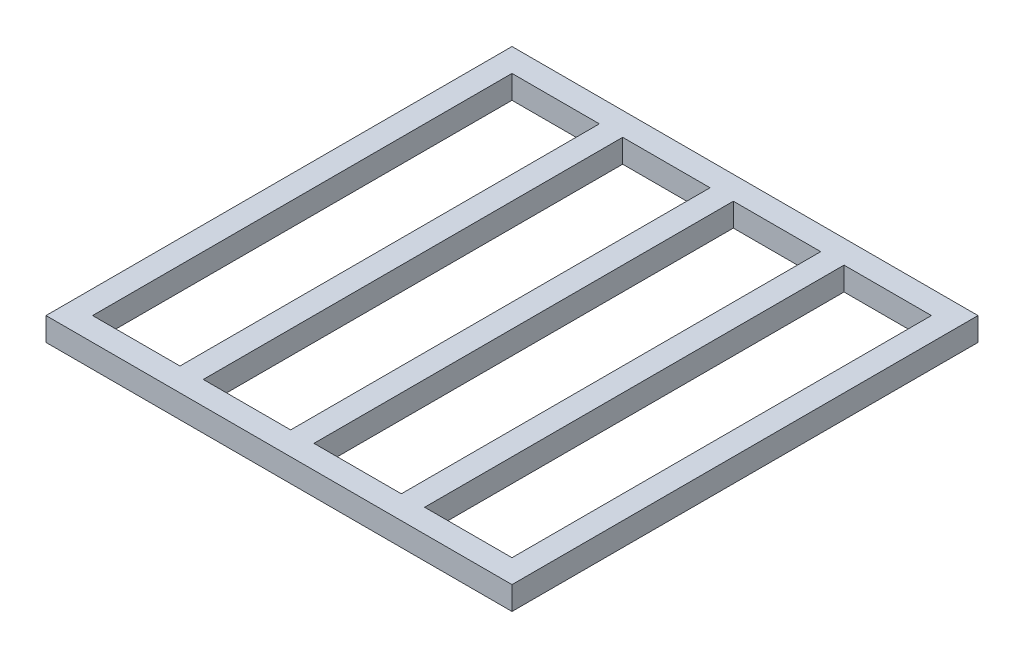
ISO-10303-21;
HEADER;
FILE_DESCRIPTION(('STEP AP214'),'2;1');
FILE_NAME('part.step','',(''),(''),'','','');
FILE_SCHEMA(('AUTOMOTIVE_DESIGN { 1 0 10303 214 1 1 1 1 }'));
ENDSEC;
DATA;
#1=APPLICATION_CONTEXT('core data for automotive mechanical design processes');
#2=APPLICATION_PROTOCOL_DEFINITION('international standard','automotive_design',2000,#1);
#3=PRODUCT_CONTEXT('',#1,'mechanical');
#4=PRODUCT('Part','Part','',(#3));
#5=PRODUCT_RELATED_PRODUCT_CATEGORY('part','',(#4));
#6=PRODUCT_DEFINITION_FORMATION('','',#4);
#7=PRODUCT_DEFINITION_CONTEXT('part definition',#1,'design');
#8=PRODUCT_DEFINITION('design','',#6,#7);
#9=PRODUCT_DEFINITION_SHAPE('','',#8);
#10=(LENGTH_UNIT() NAMED_UNIT(*) SI_UNIT(.MILLI.,.METRE.));
#11=(NAMED_UNIT(*) PLANE_ANGLE_UNIT() SI_UNIT($,.RADIAN.));
#12=(NAMED_UNIT(*) SI_UNIT($,.STERADIAN.) SOLID_ANGLE_UNIT());
#13=UNCERTAINTY_MEASURE_WITH_UNIT(LENGTH_MEASURE(1.E-05),#10,'distance_accuracy_value','');
#14=(GEOMETRIC_REPRESENTATION_CONTEXT(3) GLOBAL_UNCERTAINTY_ASSIGNED_CONTEXT((#13)) GLOBAL_UNIT_ASSIGNED_CONTEXT((#10,
#11,#12)) REPRESENTATION_CONTEXT('',''));
#15=CARTESIAN_POINT('',(0.,0.,0.));
#16=DIRECTION('',(0.,0.,1.));
#17=DIRECTION('',(1.,0.,0.));
#18=AXIS2_PLACEMENT_3D('',#15,#16,#17);
#19=CARTESIAN_POINT('',(0.,2.,0.));
#20=DIRECTION('',(0.,1.,0.));
#21=DIRECTION('',(0.,0.,1.));
#22=AXIS2_PLACEMENT_3D('',#19,#20,#21);
#23=PLANE('',#22);
#24=DIRECTION('',(0.,0.,-1.));
#25=VECTOR('',#24,1.);
#26=CARTESIAN_POINT('',(0.,2.,0.));
#27=LINE('',#26,#25);
#28=CARTESIAN_POINT('',(0.,2.,0.));
#29=VERTEX_POINT('',#28);
#30=CARTESIAN_POINT('',(0.,2.,-40.));
#31=VERTEX_POINT('',#30);
#32=EDGE_CURVE('E306',#29,#31,#27,.T.);
#33=ORIENTED_EDGE('',*,*,#32,.T.);
#34=DIRECTION('',(-1.,0.,0.));
#35=VECTOR('',#34,1.);
#36=CARTESIAN_POINT('',(0.,2.,-40.));
#37=LINE('',#36,#35);
#38=CARTESIAN_POINT('',(-40.,2.,-40.));
#39=VERTEX_POINT('',#38);
#40=EDGE_CURVE('E309',#31,#39,#37,.T.);
#41=ORIENTED_EDGE('',*,*,#40,.T.);
#42=DIRECTION('',(0.,0.,1.));
#43=VECTOR('',#42,1.);
#44=CARTESIAN_POINT('',(-40.,2.,0.));
#45=LINE('',#44,#43);
#46=CARTESIAN_POINT('',(-40.,2.,0.));
#47=VERTEX_POINT('',#46);
#48=EDGE_CURVE('E312',#39,#47,#45,.T.);
#49=ORIENTED_EDGE('',*,*,#48,.T.);
#50=DIRECTION('',(1.,0.,0.));
#51=VECTOR('',#50,1.);
#52=CARTESIAN_POINT('',(0.,2.,0.));
#53=LINE('',#52,#51);
#54=EDGE_CURVE('E314',#47,#29,#53,.T.);
#55=ORIENTED_EDGE('',*,*,#54,.T.);
#56=EDGE_LOOP('',(#33,#41,#49,#55));
#57=FACE_BOUND('',#56,.T.);
#58=DIRECTION('',(1.,0.,0.));
#59=VECTOR('',#58,1.);
#60=CARTESIAN_POINT('',(-38.,2.,-2.));
#61=LINE('',#60,#59);
#62=CARTESIAN_POINT('',(-38.,2.,-2.));
#63=VERTEX_POINT('',#62);
#64=CARTESIAN_POINT('',(-30.5,2.,-1.99999999999999));
#65=VERTEX_POINT('',#64);
#66=EDGE_CURVE('E277',#63,#65,#61,.T.);
#67=ORIENTED_EDGE('',*,*,#66,.F.);
#68=DIRECTION('',(0.,0.,1.));
#69=VECTOR('',#68,1.);
#70=CARTESIAN_POINT('',(-38.,2.,-38.));
#71=LINE('',#70,#69);
#72=CARTESIAN_POINT('',(-38.,2.,-38.));
#73=VERTEX_POINT('',#72);
#74=EDGE_CURVE('E275',#73,#63,#71,.T.);
#75=ORIENTED_EDGE('',*,*,#74,.F.);
#76=DIRECTION('',(-1.,0.,0.));
#77=VECTOR('',#76,1.);
#78=CARTESIAN_POINT('',(-38.,2.,-38.));
#79=LINE('',#78,#77);
#80=CARTESIAN_POINT('',(-30.5,2.,-38.));
#81=VERTEX_POINT('',#80);
#82=EDGE_CURVE('E283',#81,#73,#79,.T.);
#83=ORIENTED_EDGE('',*,*,#82,.F.);
#84=DIRECTION('',(0.,0.,-1.));
#85=VECTOR('',#84,1.);
#86=CARTESIAN_POINT('',(-30.5,2.,-38.));
#87=LINE('',#86,#85);
#88=EDGE_CURVE('E280',#65,#81,#87,.T.);
#89=ORIENTED_EDGE('',*,*,#88,.F.);
#90=EDGE_LOOP('',(#67,#75,#83,#89));
#91=FACE_BOUND('',#90,.T.);
#92=DIRECTION('',(0.,0.,1.));
#93=VECTOR('',#92,1.);
#94=CARTESIAN_POINT('',(-28.5,2.,-38.));
#95=LINE('',#94,#93);
#96=CARTESIAN_POINT('',(-28.5,2.,-38.));
#97=VERTEX_POINT('',#96);
#98=CARTESIAN_POINT('',(-28.5,2.,-2.));
#99=VERTEX_POINT('',#98);
#100=EDGE_CURVE('E246',#97,#99,#95,.T.);
#101=ORIENTED_EDGE('',*,*,#100,.F.);
#102=DIRECTION('',(-1.,0.,0.));
#103=VECTOR('',#102,1.);
#104=CARTESIAN_POINT('',(-28.5,2.,-38.));
#105=LINE('',#104,#103);
#106=CARTESIAN_POINT('',(-21.,2.,-38.));
#107=VERTEX_POINT('',#106);
#108=EDGE_CURVE('E244',#107,#97,#105,.T.);
#109=ORIENTED_EDGE('',*,*,#108,.F.);
#110=DIRECTION('',(0.,0.,-1.));
#111=VECTOR('',#110,1.);
#112=CARTESIAN_POINT('',(-21.,2.,-38.));
#113=LINE('',#112,#111);
#114=CARTESIAN_POINT('',(-21.,2.,-2.));
#115=VERTEX_POINT('',#114);
#116=EDGE_CURVE('E252',#115,#107,#113,.T.);
#117=ORIENTED_EDGE('',*,*,#116,.F.);
#118=DIRECTION('',(1.,0.,0.));
#119=VECTOR('',#118,1.);
#120=CARTESIAN_POINT('',(-28.5,2.,-2.));
#121=LINE('',#120,#119);
#122=EDGE_CURVE('E249',#99,#115,#121,.T.);
#123=ORIENTED_EDGE('',*,*,#122,.F.);
#124=EDGE_LOOP('',(#101,#109,#117,#123));
#125=FACE_BOUND('',#124,.T.);
#126=DIRECTION('',(0.,0.,1.));
#127=VECTOR('',#126,1.);
#128=CARTESIAN_POINT('',(-19.,2.,-38.));
#129=LINE('',#128,#127);
#130=CARTESIAN_POINT('',(-19.,2.,-38.));
#131=VERTEX_POINT('',#130);
#132=CARTESIAN_POINT('',(-19.,2.,-2.));
#133=VERTEX_POINT('',#132);
#134=EDGE_CURVE('E215',#131,#133,#129,.T.);
#135=ORIENTED_EDGE('',*,*,#134,.F.);
#136=DIRECTION('',(-1.,0.,0.));
#137=VECTOR('',#136,1.);
#138=CARTESIAN_POINT('',(-19.,2.,-38.));
#139=LINE('',#138,#137);
#140=CARTESIAN_POINT('',(-11.5,2.,-38.));
#141=VERTEX_POINT('',#140);
#142=EDGE_CURVE('E213',#141,#131,#139,.T.);
#143=ORIENTED_EDGE('',*,*,#142,.F.);
#144=DIRECTION('',(0.,0.,-1.));
#145=VECTOR('',#144,1.);
#146=CARTESIAN_POINT('',(-11.5,2.,-38.));
#147=LINE('',#146,#145);
#148=CARTESIAN_POINT('',(-11.5,2.,-2.));
#149=VERTEX_POINT('',#148);
#150=EDGE_CURVE('E221',#149,#141,#147,.T.);
#151=ORIENTED_EDGE('',*,*,#150,.F.);
#152=DIRECTION('',(1.,0.,0.));
#153=VECTOR('',#152,1.);
#154=CARTESIAN_POINT('',(-19.,2.,-2.));
#155=LINE('',#154,#153);
#156=EDGE_CURVE('E218',#133,#149,#155,.T.);
#157=ORIENTED_EDGE('',*,*,#156,.F.);
#158=EDGE_LOOP('',(#135,#143,#151,#157));
#159=FACE_BOUND('',#158,.T.);
#160=DIRECTION('',(0.,0.,1.));
#161=VECTOR('',#160,1.);
#162=CARTESIAN_POINT('',(-9.49999999999999,2.,-38.));
#163=LINE('',#162,#161);
#164=CARTESIAN_POINT('',(-9.49999999999999,2.,-38.));
#165=VERTEX_POINT('',#164);
#166=CARTESIAN_POINT('',(-9.49999999999999,2.,-2.));
#167=VERTEX_POINT('',#166);
#168=EDGE_CURVE('E185',#165,#167,#163,.T.);
#169=ORIENTED_EDGE('',*,*,#168,.F.);
#170=DIRECTION('',(-1.,0.,0.));
#171=VECTOR('',#170,1.);
#172=CARTESIAN_POINT('',(-9.49999999999999,2.,-38.));
#173=LINE('',#172,#171);
#174=CARTESIAN_POINT('',(-1.99999999999999,2.,-38.));
#175=VERTEX_POINT('',#174);
#176=EDGE_CURVE('E177',#175,#165,#173,.T.);
#177=ORIENTED_EDGE('',*,*,#176,.F.);
#178=DIRECTION('',(0.,0.,-1.));
#179=VECTOR('',#178,1.);
#180=CARTESIAN_POINT('',(-1.99999999999999,2.,-38.));
#181=LINE('',#180,#179);
#182=CARTESIAN_POINT('',(-1.99999999999999,2.,-2.));
#183=VERTEX_POINT('',#182);
#184=EDGE_CURVE('E199',#183,#175,#181,.T.);
#185=ORIENTED_EDGE('',*,*,#184,.F.);
#186=DIRECTION('',(1.,0.,0.));
#187=VECTOR('',#186,1.);
#188=CARTESIAN_POINT('',(-9.49999999999999,2.,-2.));
#189=LINE('',#188,#187);
#190=EDGE_CURVE('E197',#167,#183,#189,.T.);
#191=ORIENTED_EDGE('',*,*,#190,.F.);
#192=EDGE_LOOP('',(#169,#177,#185,#191));
#193=FACE_BOUND('',#192,.T.);
#194=ADVANCED_FACE('F40',(#57,#91,#125,#159,#193),#23,.T.);
#195=CARTESIAN_POINT('',(0.,0.,0.));
#196=DIRECTION('',(0.,1.,0.));
#197=DIRECTION('',(0.,0.,1.));
#198=AXIS2_PLACEMENT_3D('',#195,#196,#197);
#199=PLANE('',#198);
#200=DIRECTION('',(-1.,0.,0.));
#201=VECTOR('',#200,1.);
#202=CARTESIAN_POINT('',(-19.,0.,-38.));
#203=LINE('',#202,#201);
#204=CARTESIAN_POINT('',(-11.5,0.,-38.));
#205=VERTEX_POINT('',#204);
#206=CARTESIAN_POINT('',(-19.,0.,-38.));
#207=VERTEX_POINT('',#206);
#208=EDGE_CURVE('E193',#205,#207,#203,.T.);
#209=ORIENTED_EDGE('',*,*,#208,.T.);
#210=DIRECTION('',(0.,0.,1.));
#211=VECTOR('',#210,1.);
#212=CARTESIAN_POINT('',(-19.,0.,-38.));
#213=LINE('',#212,#211);
#214=CARTESIAN_POINT('',(-19.,0.,-2.));
#215=VERTEX_POINT('',#214);
#216=EDGE_CURVE('E226',#207,#215,#213,.T.);
#217=ORIENTED_EDGE('',*,*,#216,.T.);
#218=DIRECTION('',(1.,0.,0.));
#219=VECTOR('',#218,1.);
#220=CARTESIAN_POINT('',(-19.,0.,-2.));
#221=LINE('',#220,#219);
#222=CARTESIAN_POINT('',(-11.5,0.,-2.));
#223=VERTEX_POINT('',#222);
#224=EDGE_CURVE('E229',#215,#223,#221,.T.);
#225=ORIENTED_EDGE('',*,*,#224,.T.);
#226=DIRECTION('',(0.,0.,-1.));
#227=VECTOR('',#226,1.);
#228=CARTESIAN_POINT('',(-11.5,0.,-38.));
#229=LINE('',#228,#227);
#230=EDGE_CURVE('E216',#223,#205,#229,.T.);
#231=ORIENTED_EDGE('',*,*,#230,.T.);
#232=EDGE_LOOP('',(#209,#217,#225,#231));
#233=FACE_BOUND('',#232,.T.);
#234=DIRECTION('',(0.,0.,1.));
#235=VECTOR('',#234,1.);
#236=CARTESIAN_POINT('',(-38.,0.,-38.));
#237=LINE('',#236,#235);
#238=CARTESIAN_POINT('',(-38.,0.,-38.));
#239=VERTEX_POINT('',#238);
#240=CARTESIAN_POINT('',(-38.,0.,-2.));
#241=VERTEX_POINT('',#240);
#242=EDGE_CURVE('E274',#239,#241,#237,.T.);
#243=ORIENTED_EDGE('',*,*,#242,.T.);
#244=DIRECTION('',(1.,0.,0.));
#245=VECTOR('',#244,1.);
#246=CARTESIAN_POINT('',(-38.,0.,-2.));
#247=LINE('',#246,#245);
#248=CARTESIAN_POINT('',(-30.5,0.,-1.99999999999999));
#249=VERTEX_POINT('',#248);
#250=EDGE_CURVE('E288',#241,#249,#247,.T.);
#251=ORIENTED_EDGE('',*,*,#250,.T.);
#252=DIRECTION('',(0.,0.,-1.));
#253=VECTOR('',#252,1.);
#254=CARTESIAN_POINT('',(-30.5,0.,-38.));
#255=LINE('',#254,#253);
#256=CARTESIAN_POINT('',(-30.5,0.,-38.));
#257=VERTEX_POINT('',#256);
#258=EDGE_CURVE('E291',#249,#257,#255,.T.);
#259=ORIENTED_EDGE('',*,*,#258,.T.);
#260=DIRECTION('',(-1.,0.,0.));
#261=VECTOR('',#260,1.);
#262=CARTESIAN_POINT('',(-38.,0.,-38.));
#263=LINE('',#262,#261);
#264=EDGE_CURVE('E278',#257,#239,#263,.T.);
#265=ORIENTED_EDGE('',*,*,#264,.T.);
#266=EDGE_LOOP('',(#243,#251,#259,#265));
#267=FACE_BOUND('',#266,.T.);
#268=DIRECTION('',(0.,0.,-1.));
#269=VECTOR('',#268,1.);
#270=CARTESIAN_POINT('',(0.,0.,0.));
#271=LINE('',#270,#269);
#272=CARTESIAN_POINT('',(0.,0.,0.));
#273=VERTEX_POINT('',#272);
#274=CARTESIAN_POINT('',(0.,0.,-40.));
#275=VERTEX_POINT('',#274);
#276=EDGE_CURVE('E305',#273,#275,#271,.T.);
#277=ORIENTED_EDGE('',*,*,#276,.F.);
#278=DIRECTION('',(1.,0.,0.));
#279=VECTOR('',#278,1.);
#280=CARTESIAN_POINT('',(0.,0.,0.));
#281=LINE('',#280,#279);
#282=CARTESIAN_POINT('',(-40.,0.,0.));
#283=VERTEX_POINT('',#282);
#284=EDGE_CURVE('E310',#283,#273,#281,.T.);
#285=ORIENTED_EDGE('',*,*,#284,.F.);
#286=DIRECTION('',(0.,0.,1.));
#287=VECTOR('',#286,1.);
#288=CARTESIAN_POINT('',(-40.,0.,0.));
#289=LINE('',#288,#287);
#290=CARTESIAN_POINT('',(-40.,0.,-40.));
#291=VERTEX_POINT('',#290);
#292=EDGE_CURVE('E321',#291,#283,#289,.T.);
#293=ORIENTED_EDGE('',*,*,#292,.F.);
#294=DIRECTION('',(-1.,0.,0.));
#295=VECTOR('',#294,1.);
#296=CARTESIAN_POINT('',(0.,0.,-40.));
#297=LINE('',#296,#295);
#298=EDGE_CURVE('E319',#275,#291,#297,.T.);
#299=ORIENTED_EDGE('',*,*,#298,.F.);
#300=EDGE_LOOP('',(#277,#285,#293,#299));
#301=FACE_BOUND('',#300,.T.);
#302=DIRECTION('',(-1.,0.,0.));
#303=VECTOR('',#302,1.);
#304=CARTESIAN_POINT('',(-28.5,0.,-38.));
#305=LINE('',#304,#303);
#306=CARTESIAN_POINT('',(-21.,0.,-38.));
#307=VERTEX_POINT('',#306);
#308=CARTESIAN_POINT('',(-28.5,0.,-38.));
#309=VERTEX_POINT('',#308);
#310=EDGE_CURVE('E243',#307,#309,#305,.T.);
#311=ORIENTED_EDGE('',*,*,#310,.T.);
#312=DIRECTION('',(0.,0.,1.));
#313=VECTOR('',#312,1.);
#314=CARTESIAN_POINT('',(-28.5,0.,-38.));
#315=LINE('',#314,#313);
#316=CARTESIAN_POINT('',(-28.5,0.,-2.));
#317=VERTEX_POINT('',#316);
#318=EDGE_CURVE('E257',#309,#317,#315,.T.);
#319=ORIENTED_EDGE('',*,*,#318,.T.);
#320=DIRECTION('',(1.,0.,0.));
#321=VECTOR('',#320,1.);
#322=CARTESIAN_POINT('',(-28.5,0.,-2.));
#323=LINE('',#322,#321);
#324=CARTESIAN_POINT('',(-21.,0.,-2.));
#325=VERTEX_POINT('',#324);
#326=EDGE_CURVE('E260',#317,#325,#323,.T.);
#327=ORIENTED_EDGE('',*,*,#326,.T.);
#328=DIRECTION('',(0.,0.,-1.));
#329=VECTOR('',#328,1.);
#330=CARTESIAN_POINT('',(-21.,0.,-38.));
#331=LINE('',#330,#329);
#332=EDGE_CURVE('E247',#325,#307,#331,.T.);
#333=ORIENTED_EDGE('',*,*,#332,.T.);
#334=EDGE_LOOP('',(#311,#319,#327,#333));
#335=FACE_BOUND('',#334,.T.);
#336=DIRECTION('',(-1.,0.,0.));
#337=VECTOR('',#336,1.);
#338=CARTESIAN_POINT('',(-9.49999999999999,0.,-38.));
#339=LINE('',#338,#337);
#340=CARTESIAN_POINT('',(-1.99999999999999,0.,-38.));
#341=VERTEX_POINT('',#340);
#342=CARTESIAN_POINT('',(-9.49999999999999,0.,-38.));
#343=VERTEX_POINT('',#342);
#344=EDGE_CURVE('E63',#341,#343,#339,.T.);
#345=ORIENTED_EDGE('',*,*,#344,.T.);
#346=DIRECTION('',(0.,0.,1.));
#347=VECTOR('',#346,1.);
#348=CARTESIAN_POINT('',(-9.49999999999999,0.,-38.));
#349=LINE('',#348,#347);
#350=CARTESIAN_POINT('',(-9.49999999999999,0.,-2.));
#351=VERTEX_POINT('',#350);
#352=EDGE_CURVE('E192',#343,#351,#349,.T.);
#353=ORIENTED_EDGE('',*,*,#352,.T.);
#354=DIRECTION('',(1.,0.,0.));
#355=VECTOR('',#354,1.);
#356=CARTESIAN_POINT('',(-9.49999999999999,0.,-2.));
#357=LINE('',#356,#355);
#358=CARTESIAN_POINT('',(-1.99999999999999,0.,-2.));
#359=VERTEX_POINT('',#358);
#360=EDGE_CURVE('E205',#351,#359,#357,.T.);
#361=ORIENTED_EDGE('',*,*,#360,.T.);
#362=DIRECTION('',(0.,0.,-1.));
#363=VECTOR('',#362,1.);
#364=CARTESIAN_POINT('',(-1.99999999999999,0.,-38.));
#365=LINE('',#364,#363);
#366=EDGE_CURVE('E186',#359,#341,#365,.T.);
#367=ORIENTED_EDGE('',*,*,#366,.T.);
#368=EDGE_LOOP('',(#345,#353,#361,#367));
#369=FACE_BOUND('',#368,.T.);
#370=ADVANCED_FACE('F339',(#233,#267,#301,#335,#369),#199,.F.);
#371=CARTESIAN_POINT('',(0.,2.,0.));
#372=DIRECTION('',(-1.,0.,0.));
#373=DIRECTION('',(0.,0.,1.));
#374=AXIS2_PLACEMENT_3D('',#371,#372,#373);
#375=PLANE('',#374);
#376=ORIENTED_EDGE('',*,*,#276,.T.);
#377=DIRECTION('',(0.,-1.,0.));
#378=VECTOR('',#377,1.);
#379=CARTESIAN_POINT('',(0.,2.,-40.));
#380=LINE('',#379,#378);
#381=EDGE_CURVE('E11',#31,#275,#380,.T.);
#382=ORIENTED_EDGE('',*,*,#381,.F.);
#383=ORIENTED_EDGE('',*,*,#32,.F.);
#384=DIRECTION('',(0.,-1.,0.));
#385=VECTOR('',#384,1.);
#386=CARTESIAN_POINT('',(0.,2.,0.));
#387=LINE('',#386,#385);
#388=EDGE_CURVE('E316',#29,#273,#387,.T.);
#389=ORIENTED_EDGE('',*,*,#388,.T.);
#390=EDGE_LOOP('',(#376,#382,#383,#389));
#391=FACE_BOUND('',#390,.T.);
#392=ADVANCED_FACE('F42',(#391),#375,.F.);
#393=CARTESIAN_POINT('',(0.,2.,-40.));
#394=DIRECTION('',(0.,0.,1.));
#395=DIRECTION('',(1.,0.,0.));
#396=AXIS2_PLACEMENT_3D('',#393,#394,#395);
#397=PLANE('',#396);
#398=ORIENTED_EDGE('',*,*,#298,.T.);
#399=DIRECTION('',(0.,-1.,0.));
#400=VECTOR('',#399,1.);
#401=CARTESIAN_POINT('',(-40.,2.,-40.));
#402=LINE('',#401,#400);
#403=EDGE_CURVE('E48',#39,#291,#402,.T.);
#404=ORIENTED_EDGE('',*,*,#403,.F.);
#405=ORIENTED_EDGE('',*,*,#40,.F.);
#406=ORIENTED_EDGE('',*,*,#381,.T.);
#407=EDGE_LOOP('',(#398,#404,#405,#406));
#408=FACE_BOUND('',#407,.T.);
#409=ADVANCED_FACE('F350',(#408),#397,.F.);
#410=CARTESIAN_POINT('',(-40.,2.,0.));
#411=DIRECTION('',(1.,0.,0.));
#412=DIRECTION('',(0.,0.,-1.));
#413=AXIS2_PLACEMENT_3D('',#410,#411,#412);
#414=PLANE('',#413);
#415=ORIENTED_EDGE('',*,*,#292,.T.);
#416=DIRECTION('',(0.,-1.,0.));
#417=VECTOR('',#416,1.);
#418=CARTESIAN_POINT('',(-40.,2.,0.));
#419=LINE('',#418,#417);
#420=EDGE_CURVE('E326',#47,#283,#419,.T.);
#421=ORIENTED_EDGE('',*,*,#420,.F.);
#422=ORIENTED_EDGE('',*,*,#48,.F.);
#423=ORIENTED_EDGE('',*,*,#403,.T.);
#424=EDGE_LOOP('',(#415,#421,#422,#423));
#425=FACE_BOUND('',#424,.T.);
#426=ADVANCED_FACE('F333',(#425),#414,.F.);
#427=CARTESIAN_POINT('',(0.,2.,0.));
#428=DIRECTION('',(0.,0.,-1.));
#429=DIRECTION('',(-1.,0.,0.));
#430=AXIS2_PLACEMENT_3D('',#427,#428,#429);
#431=PLANE('',#430);
#432=ORIENTED_EDGE('',*,*,#284,.T.);
#433=ORIENTED_EDGE('',*,*,#388,.F.);
#434=ORIENTED_EDGE('',*,*,#54,.F.);
#435=ORIENTED_EDGE('',*,*,#420,.T.);
#436=EDGE_LOOP('',(#432,#433,#434,#435));
#437=FACE_BOUND('',#436,.T.);
#438=ADVANCED_FACE('F343',(#437),#431,.F.);
#439=CARTESIAN_POINT('',(-38.,2.,-38.));
#440=DIRECTION('',(1.,0.,0.));
#441=DIRECTION('',(0.,0.,-1.));
#442=AXIS2_PLACEMENT_3D('',#439,#440,#441);
#443=PLANE('',#442);
#444=ORIENTED_EDGE('',*,*,#242,.F.);
#445=DIRECTION('',(0.,-1.,0.));
#446=VECTOR('',#445,1.);
#447=CARTESIAN_POINT('',(-38.,2.,-38.));
#448=LINE('',#447,#446);
#449=EDGE_CURVE('E285',#73,#239,#448,.T.);
#450=ORIENTED_EDGE('',*,*,#449,.F.);
#451=ORIENTED_EDGE('',*,*,#74,.T.);
#452=DIRECTION('',(0.,-1.,0.));
#453=VECTOR('',#452,1.);
#454=CARTESIAN_POINT('',(-38.,2.,-2.));
#455=LINE('',#454,#453);
#456=EDGE_CURVE('E302',#63,#241,#455,.T.);
#457=ORIENTED_EDGE('',*,*,#456,.T.);
#458=EDGE_LOOP('',(#444,#450,#451,#457));
#459=FACE_BOUND('',#458,.T.);
#460=ADVANCED_FACE('F365',(#459),#443,.T.);
#461=CARTESIAN_POINT('',(-38.,2.,-2.));
#462=DIRECTION('',(0.,0.,-1.));
#463=DIRECTION('',(-1.,0.,0.));
#464=AXIS2_PLACEMENT_3D('',#461,#462,#463);
#465=PLANE('',#464);
#466=ORIENTED_EDGE('',*,*,#250,.F.);
#467=ORIENTED_EDGE('',*,*,#456,.F.);
#468=ORIENTED_EDGE('',*,*,#66,.T.);
#469=DIRECTION('',(0.,-1.,0.));
#470=VECTOR('',#469,1.);
#471=CARTESIAN_POINT('',(-30.5,2.,-1.99999999999999));
#472=LINE('',#471,#470);
#473=EDGE_CURVE('E300',#65,#249,#472,.T.);
#474=ORIENTED_EDGE('',*,*,#473,.T.);
#475=EDGE_LOOP('',(#466,#467,#468,#474));
#476=FACE_BOUND('',#475,.T.);
#477=ADVANCED_FACE('F372',(#476),#465,.T.);
#478=CARTESIAN_POINT('',(-30.5,2.,-38.));
#479=DIRECTION('',(-1.,0.,0.));
#480=DIRECTION('',(0.,0.,1.));
#481=AXIS2_PLACEMENT_3D('',#478,#479,#480);
#482=PLANE('',#481);
#483=ORIENTED_EDGE('',*,*,#258,.F.);
#484=ORIENTED_EDGE('',*,*,#473,.F.);
#485=ORIENTED_EDGE('',*,*,#88,.T.);
#486=DIRECTION('',(0.,-1.,0.));
#487=VECTOR('',#486,1.);
#488=CARTESIAN_POINT('',(-30.5,2.,-38.));
#489=LINE('',#488,#487);
#490=EDGE_CURVE('E298',#81,#257,#489,.T.);
#491=ORIENTED_EDGE('',*,*,#490,.T.);
#492=EDGE_LOOP('',(#483,#484,#485,#491));
#493=FACE_BOUND('',#492,.T.);
#494=ADVANCED_FACE('F377',(#493),#482,.T.);
#495=CARTESIAN_POINT('',(-38.,2.,-38.));
#496=DIRECTION('',(0.,0.,1.));
#497=DIRECTION('',(1.,0.,0.));
#498=AXIS2_PLACEMENT_3D('',#495,#496,#497);
#499=PLANE('',#498);
#500=ORIENTED_EDGE('',*,*,#264,.F.);
#501=ORIENTED_EDGE('',*,*,#490,.F.);
#502=ORIENTED_EDGE('',*,*,#82,.T.);
#503=ORIENTED_EDGE('',*,*,#449,.T.);
#504=EDGE_LOOP('',(#500,#501,#502,#503));
#505=FACE_BOUND('',#504,.T.);
#506=ADVANCED_FACE('F385',(#505),#499,.T.);
#507=CARTESIAN_POINT('',(-28.5,2.,-38.));
#508=DIRECTION('',(0.,0.,1.));
#509=DIRECTION('',(1.,0.,0.));
#510=AXIS2_PLACEMENT_3D('',#507,#508,#509);
#511=PLANE('',#510);
#512=ORIENTED_EDGE('',*,*,#310,.F.);
#513=DIRECTION('',(0.,-1.,0.));
#514=VECTOR('',#513,1.);
#515=CARTESIAN_POINT('',(-21.,2.,-38.));
#516=LINE('',#515,#514);
#517=EDGE_CURVE('E254',#107,#307,#516,.T.);
#518=ORIENTED_EDGE('',*,*,#517,.F.);
#519=ORIENTED_EDGE('',*,*,#108,.T.);
#520=DIRECTION('',(0.,-1.,0.));
#521=VECTOR('',#520,1.);
#522=CARTESIAN_POINT('',(-28.5,2.,-38.));
#523=LINE('',#522,#521);
#524=EDGE_CURVE('E271',#97,#309,#523,.T.);
#525=ORIENTED_EDGE('',*,*,#524,.T.);
#526=EDGE_LOOP('',(#512,#518,#519,#525));
#527=FACE_BOUND('',#526,.T.);
#528=ADVANCED_FACE('F439',(#527),#511,.T.);
#529=CARTESIAN_POINT('',(-28.5,2.,-38.));
#530=DIRECTION('',(1.,0.,0.));
#531=DIRECTION('',(0.,0.,-1.));
#532=AXIS2_PLACEMENT_3D('',#529,#530,#531);
#533=PLANE('',#532);
#534=ORIENTED_EDGE('',*,*,#318,.F.);
#535=ORIENTED_EDGE('',*,*,#524,.F.);
#536=ORIENTED_EDGE('',*,*,#100,.T.);
#537=DIRECTION('',(0.,-1.,0.));
#538=VECTOR('',#537,1.);
#539=CARTESIAN_POINT('',(-28.5,2.,-2.));
#540=LINE('',#539,#538);
#541=EDGE_CURVE('E269',#99,#317,#540,.T.);
#542=ORIENTED_EDGE('',*,*,#541,.T.);
#543=EDGE_LOOP('',(#534,#535,#536,#542));
#544=FACE_BOUND('',#543,.T.);
#545=ADVANCED_FACE('F435',(#544),#533,.T.);
#546=CARTESIAN_POINT('',(-28.5,2.,-2.));
#547=DIRECTION('',(0.,0.,-1.));
#548=DIRECTION('',(-1.,0.,0.));
#549=AXIS2_PLACEMENT_3D('',#546,#547,#548);
#550=PLANE('',#549);
#551=ORIENTED_EDGE('',*,*,#326,.F.);
#552=ORIENTED_EDGE('',*,*,#541,.F.);
#553=ORIENTED_EDGE('',*,*,#122,.T.);
#554=DIRECTION('',(0.,-1.,0.));
#555=VECTOR('',#554,1.);
#556=CARTESIAN_POINT('',(-21.,2.,-2.));
#557=LINE('',#556,#555);
#558=EDGE_CURVE('E267',#115,#325,#557,.T.);
#559=ORIENTED_EDGE('',*,*,#558,.T.);
#560=EDGE_LOOP('',(#551,#552,#553,#559));
#561=FACE_BOUND('',#560,.T.);
#562=ADVANCED_FACE('F431',(#561),#550,.T.);
#563=CARTESIAN_POINT('',(-21.,2.,-38.));
#564=DIRECTION('',(-1.,0.,0.));
#565=DIRECTION('',(0.,0.,1.));
#566=AXIS2_PLACEMENT_3D('',#563,#564,#565);
#567=PLANE('',#566);
#568=ORIENTED_EDGE('',*,*,#332,.F.);
#569=ORIENTED_EDGE('',*,*,#558,.F.);
#570=ORIENTED_EDGE('',*,*,#116,.T.);
#571=ORIENTED_EDGE('',*,*,#517,.T.);
#572=EDGE_LOOP('',(#568,#569,#570,#571));
#573=FACE_BOUND('',#572,.T.);
#574=ADVANCED_FACE('F428',(#573),#567,.T.);
#575=CARTESIAN_POINT('',(-19.,2.,-38.));
#576=DIRECTION('',(0.,0.,1.));
#577=DIRECTION('',(1.,0.,0.));
#578=AXIS2_PLACEMENT_3D('',#575,#576,#577);
#579=PLANE('',#578);
#580=ORIENTED_EDGE('',*,*,#208,.F.);
#581=DIRECTION('',(0.,-1.,0.));
#582=VECTOR('',#581,1.);
#583=CARTESIAN_POINT('',(-11.5,2.,-38.));
#584=LINE('',#583,#582);
#585=EDGE_CURVE('E223',#141,#205,#584,.T.);
#586=ORIENTED_EDGE('',*,*,#585,.F.);
#587=ORIENTED_EDGE('',*,*,#142,.T.);
#588=DIRECTION('',(0.,-1.,0.));
#589=VECTOR('',#588,1.);
#590=CARTESIAN_POINT('',(-19.,2.,-38.));
#591=LINE('',#590,#589);
#592=EDGE_CURVE('E240',#131,#207,#591,.T.);
#593=ORIENTED_EDGE('',*,*,#592,.T.);
#594=EDGE_LOOP('',(#580,#586,#587,#593));
#595=FACE_BOUND('',#594,.T.);
#596=ADVANCED_FACE('F410',(#595),#579,.T.);
#597=CARTESIAN_POINT('',(-19.,2.,-38.));
#598=DIRECTION('',(1.,0.,0.));
#599=DIRECTION('',(0.,0.,-1.));
#600=AXIS2_PLACEMENT_3D('',#597,#598,#599);
#601=PLANE('',#600);
#602=ORIENTED_EDGE('',*,*,#216,.F.);
#603=ORIENTED_EDGE('',*,*,#592,.F.);
#604=ORIENTED_EDGE('',*,*,#134,.T.);
#605=DIRECTION('',(0.,-1.,0.));
#606=VECTOR('',#605,1.);
#607=CARTESIAN_POINT('',(-19.,2.,-2.));
#608=LINE('',#607,#606);
#609=EDGE_CURVE('E238',#133,#215,#608,.T.);
#610=ORIENTED_EDGE('',*,*,#609,.T.);
#611=EDGE_LOOP('',(#602,#603,#604,#610));
#612=FACE_BOUND('',#611,.T.);
#613=ADVANCED_FACE('F404',(#612),#601,.T.);
#614=CARTESIAN_POINT('',(-19.,2.,-2.));
#615=DIRECTION('',(0.,0.,-1.));
#616=DIRECTION('',(-1.,0.,0.));
#617=AXIS2_PLACEMENT_3D('',#614,#615,#616);
#618=PLANE('',#617);
#619=ORIENTED_EDGE('',*,*,#224,.F.);
#620=ORIENTED_EDGE('',*,*,#609,.F.);
#621=ORIENTED_EDGE('',*,*,#156,.T.);
#622=DIRECTION('',(0.,-1.,0.));
#623=VECTOR('',#622,1.);
#624=CARTESIAN_POINT('',(-11.5,2.,-2.));
#625=LINE('',#624,#623);
#626=EDGE_CURVE('E236',#149,#223,#625,.T.);
#627=ORIENTED_EDGE('',*,*,#626,.T.);
#628=EDGE_LOOP('',(#619,#620,#621,#627));
#629=FACE_BOUND('',#628,.T.);
#630=ADVANCED_FACE('F407',(#629),#618,.T.);
#631=CARTESIAN_POINT('',(-11.5,2.,-38.));
#632=DIRECTION('',(-1.,0.,0.));
#633=DIRECTION('',(0.,0.,1.));
#634=AXIS2_PLACEMENT_3D('',#631,#632,#633);
#635=PLANE('',#634);
#636=ORIENTED_EDGE('',*,*,#230,.F.);
#637=ORIENTED_EDGE('',*,*,#626,.F.);
#638=ORIENTED_EDGE('',*,*,#150,.T.);
#639=ORIENTED_EDGE('',*,*,#585,.T.);
#640=EDGE_LOOP('',(#636,#637,#638,#639));
#641=FACE_BOUND('',#640,.T.);
#642=ADVANCED_FACE('F413',(#641),#635,.T.);
#643=CARTESIAN_POINT('',(-9.49999999999999,2.,-38.));
#644=DIRECTION('',(0.,0.,1.));
#645=DIRECTION('',(1.,0.,0.));
#646=AXIS2_PLACEMENT_3D('',#643,#644,#645);
#647=PLANE('',#646);
#648=ORIENTED_EDGE('',*,*,#344,.F.);
#649=DIRECTION('',(0.,-1.,0.));
#650=VECTOR('',#649,1.);
#651=CARTESIAN_POINT('',(-1.99999999999999,2.,-38.));
#652=LINE('',#651,#650);
#653=EDGE_CURVE('E181',#175,#341,#652,.T.);
#654=ORIENTED_EDGE('',*,*,#653,.F.);
#655=ORIENTED_EDGE('',*,*,#176,.T.);
#656=DIRECTION('',(0.,-1.,0.));
#657=VECTOR('',#656,1.);
#658=CARTESIAN_POINT('',(-9.49999999999999,2.,-38.));
#659=LINE('',#658,#657);
#660=EDGE_CURVE('E180',#165,#343,#659,.T.);
#661=ORIENTED_EDGE('',*,*,#660,.T.);
#662=EDGE_LOOP('',(#648,#654,#655,#661));
#663=FACE_BOUND('',#662,.T.);
#664=ADVANCED_FACE('F179',(#663),#647,.T.);
#665=CARTESIAN_POINT('',(-9.49999999999999,2.,-38.));
#666=DIRECTION('',(1.,0.,0.));
#667=DIRECTION('',(0.,0.,-1.));
#668=AXIS2_PLACEMENT_3D('',#665,#666,#667);
#669=PLANE('',#668);
#670=ORIENTED_EDGE('',*,*,#352,.F.);
#671=ORIENTED_EDGE('',*,*,#660,.F.);
#672=ORIENTED_EDGE('',*,*,#168,.T.);
#673=DIRECTION('',(0.,-1.,0.));
#674=VECTOR('',#673,1.);
#675=CARTESIAN_POINT('',(-9.49999999999999,2.,-2.));
#676=LINE('',#675,#674);
#677=EDGE_CURVE('E194',#167,#351,#676,.T.);
#678=ORIENTED_EDGE('',*,*,#677,.T.);
#679=EDGE_LOOP('',(#670,#671,#672,#678));
#680=FACE_BOUND('',#679,.T.);
#681=ADVANCED_FACE('F189',(#680),#669,.T.);
#682=CARTESIAN_POINT('',(-9.49999999999999,2.,-2.));
#683=DIRECTION('',(0.,0.,-1.));
#684=DIRECTION('',(-1.,0.,0.));
#685=AXIS2_PLACEMENT_3D('',#682,#683,#684);
#686=PLANE('',#685);
#687=ORIENTED_EDGE('',*,*,#360,.F.);
#688=ORIENTED_EDGE('',*,*,#677,.F.);
#689=ORIENTED_EDGE('',*,*,#190,.T.);
#690=DIRECTION('',(0.,-1.,0.));
#691=VECTOR('',#690,1.);
#692=CARTESIAN_POINT('',(-1.99999999999999,2.,-2.));
#693=LINE('',#692,#691);
#694=EDGE_CURVE('E55',#183,#359,#693,.T.);
#695=ORIENTED_EDGE('',*,*,#694,.T.);
#696=EDGE_LOOP('',(#687,#688,#689,#695));
#697=FACE_BOUND('',#696,.T.);
#698=ADVANCED_FACE('F505',(#697),#686,.T.);
#699=CARTESIAN_POINT('',(-1.99999999999999,2.,-38.));
#700=DIRECTION('',(-1.,0.,0.));
#701=DIRECTION('',(0.,0.,1.));
#702=AXIS2_PLACEMENT_3D('',#699,#700,#701);
#703=PLANE('',#702);
#704=ORIENTED_EDGE('',*,*,#366,.F.);
#705=ORIENTED_EDGE('',*,*,#694,.F.);
#706=ORIENTED_EDGE('',*,*,#184,.T.);
#707=ORIENTED_EDGE('',*,*,#653,.T.);
#708=EDGE_LOOP('',(#704,#705,#706,#707));
#709=FACE_BOUND('',#708,.T.);
#710=ADVANCED_FACE('F514',(#709),#703,.T.);
#711=CLOSED_SHELL('',(#194,#370,#392,#409,#426,#438,#460,#477,#494,#506,#528,#545,#562,#574,
#596,#613,#630,#642,#664,#681,#698,#710));
#712=MANIFOLD_SOLID_BREP('B2',#711);
#713=ADVANCED_BREP_SHAPE_REPRESENTATION('',(#18,#712),#14);
#714=SHAPE_DEFINITION_REPRESENTATION(#9,#713);
ENDSEC;
END-ISO-10303-21;
